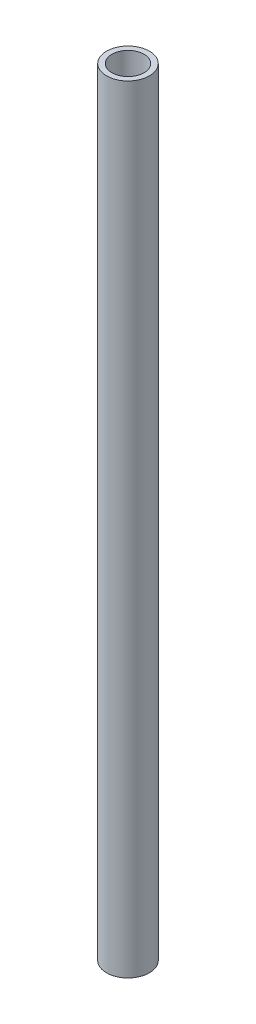
ISO-10303-21;
HEADER;
FILE_DESCRIPTION(('STEP AP214'),'2;1');
FILE_NAME('part.step','',(''),(''),'','','');
FILE_SCHEMA(('AUTOMOTIVE_DESIGN { 1 0 10303 214 1 1 1 1 }'));
ENDSEC;
DATA;
#1=APPLICATION_CONTEXT('core data for automotive mechanical design processes');
#2=APPLICATION_PROTOCOL_DEFINITION('international standard','automotive_design',2000,#1);
#3=PRODUCT_CONTEXT('',#1,'mechanical');
#4=PRODUCT('Part','Part','',(#3));
#5=PRODUCT_RELATED_PRODUCT_CATEGORY('part','',(#4));
#6=PRODUCT_DEFINITION_FORMATION('','',#4);
#7=PRODUCT_DEFINITION_CONTEXT('part definition',#1,'design');
#8=PRODUCT_DEFINITION('design','',#6,#7);
#9=PRODUCT_DEFINITION_SHAPE('','',#8);
#10=(LENGTH_UNIT() NAMED_UNIT(*) SI_UNIT(.MILLI.,.METRE.));
#11=(NAMED_UNIT(*) PLANE_ANGLE_UNIT() SI_UNIT($,.RADIAN.));
#12=(NAMED_UNIT(*) SI_UNIT($,.STERADIAN.) SOLID_ANGLE_UNIT());
#13=UNCERTAINTY_MEASURE_WITH_UNIT(LENGTH_MEASURE(1.E-05),#10,'distance_accuracy_value','');
#14=(GEOMETRIC_REPRESENTATION_CONTEXT(3) GLOBAL_UNCERTAINTY_ASSIGNED_CONTEXT((#13)) GLOBAL_UNIT_ASSIGNED_CONTEXT((#10,
#11,#12)) REPRESENTATION_CONTEXT('',''));
#15=CARTESIAN_POINT('',(0.,0.,0.));
#16=DIRECTION('',(0.,0.,1.));
#17=DIRECTION('',(1.,0.,0.));
#18=AXIS2_PLACEMENT_3D('',#15,#16,#17);
#19=CARTESIAN_POINT('',(0.,145.,0.));
#20=DIRECTION('',(0.,1.,0.));
#21=DIRECTION('',(0.,0.,1.));
#22=AXIS2_PLACEMENT_3D('',#19,#20,#21);
#23=PLANE('',#22);
#24=CARTESIAN_POINT('',(0.,145.,0.));
#25=DIRECTION('',(0.,1.,0.));
#26=DIRECTION('',(0.,0.,1.));
#27=AXIS2_PLACEMENT_3D('',#24,#25,#26);
#28=CIRCLE('',#27,4.);
#29=CARTESIAN_POINT('',(0.,145.,4.));
#30=VERTEX_POINT('',#29);
#31=EDGE_CURVE('E10',#30,#30,#28,.T.);
#32=ORIENTED_EDGE('',*,*,#31,.T.);
#33=EDGE_LOOP('',(#32));
#34=FACE_BOUND('',#33,.T.);
#35=CARTESIAN_POINT('',(0.,145.,0.));
#36=DIRECTION('',(0.,1.,0.));
#37=DIRECTION('',(0.,0.,1.));
#38=AXIS2_PLACEMENT_3D('',#35,#36,#37);
#39=CIRCLE('',#38,3.);
#40=CARTESIAN_POINT('',(0.,145.,3.));
#41=VERTEX_POINT('',#40);
#42=EDGE_CURVE('E43',#41,#41,#39,.T.);
#43=ORIENTED_EDGE('',*,*,#42,.F.);
#44=EDGE_LOOP('',(#43));
#45=FACE_BOUND('',#44,.T.);
#46=ADVANCED_FACE('F32',(#34,#45),#23,.T.);
#47=CARTESIAN_POINT('',(0.,0.,0.));
#48=DIRECTION('',(0.,1.,0.));
#49=DIRECTION('',(0.,0.,1.));
#50=AXIS2_PLACEMENT_3D('',#47,#48,#49);
#51=PLANE('',#50);
#52=CARTESIAN_POINT('',(0.,0.,0.));
#53=DIRECTION('',(0.,1.,0.));
#54=DIRECTION('',(0.,0.,1.));
#55=AXIS2_PLACEMENT_3D('',#52,#53,#54);
#56=CIRCLE('',#55,4.);
#57=CARTESIAN_POINT('',(0.,0.,4.));
#58=VERTEX_POINT('',#57);
#59=EDGE_CURVE('E36',#58,#58,#56,.T.);
#60=ORIENTED_EDGE('',*,*,#59,.F.);
#61=EDGE_LOOP('',(#60));
#62=FACE_BOUND('',#61,.T.);
#63=CARTESIAN_POINT('',(0.,0.,0.));
#64=DIRECTION('',(0.,1.,0.));
#65=DIRECTION('',(0.,0.,1.));
#66=AXIS2_PLACEMENT_3D('',#63,#64,#65);
#67=CIRCLE('',#66,3.);
#68=CARTESIAN_POINT('',(0.,0.,3.));
#69=VERTEX_POINT('',#68);
#70=EDGE_CURVE('E45',#69,#69,#67,.T.);
#71=ORIENTED_EDGE('',*,*,#70,.T.);
#72=EDGE_LOOP('',(#71));
#73=FACE_BOUND('',#72,.T.);
#74=ADVANCED_FACE('F55',(#62,#73),#51,.F.);
#75=CARTESIAN_POINT('',(0.,145.,0.));
#76=DIRECTION('',(0.,-1.,0.));
#77=DIRECTION('',(0.,0.,-1.));
#78=AXIS2_PLACEMENT_3D('',#75,#76,#77);
#79=CYLINDRICAL_SURFACE('',#78,4.);
#80=ORIENTED_EDGE('',*,*,#31,.F.);
#81=EDGE_LOOP('',(#80));
#82=FACE_BOUND('',#81,.T.);
#83=ORIENTED_EDGE('',*,*,#59,.T.);
#84=EDGE_LOOP('',(#83));
#85=FACE_BOUND('',#84,.T.);
#86=ADVANCED_FACE('F34',(#82,#85),#79,.T.);
#87=CARTESIAN_POINT('',(0.,145.,0.));
#88=DIRECTION('',(0.,-1.,0.));
#89=DIRECTION('',(0.,0.,-1.));
#90=AXIS2_PLACEMENT_3D('',#87,#88,#89);
#91=CYLINDRICAL_SURFACE('',#90,3.);
#92=ORIENTED_EDGE('',*,*,#42,.T.);
#93=EDGE_LOOP('',(#92));
#94=FACE_BOUND('',#93,.T.);
#95=ORIENTED_EDGE('',*,*,#70,.F.);
#96=EDGE_LOOP('',(#95));
#97=FACE_BOUND('',#96,.T.);
#98=ADVANCED_FACE('F51',(#94,#97),#91,.F.);
#99=CLOSED_SHELL('',(#46,#74,#86,#98));
#100=MANIFOLD_SOLID_BREP('B2',#99);
#101=ADVANCED_BREP_SHAPE_REPRESENTATION('',(#18,#100),#14);
#102=SHAPE_DEFINITION_REPRESENTATION(#9,#101);
ENDSEC;
END-ISO-10303-21;
